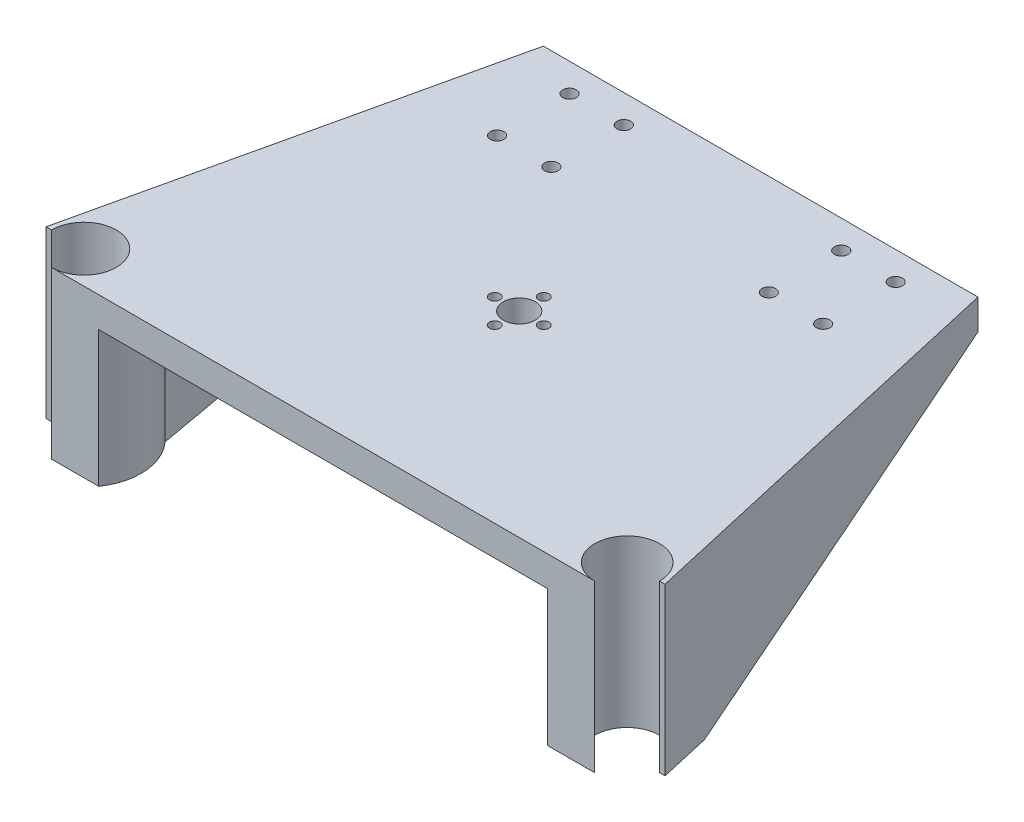
ISO-10303-21;
HEADER;
FILE_DESCRIPTION(('STEP AP214'),'2;1');
FILE_NAME('part.step','',(''),(''),'','','');
FILE_SCHEMA(('AUTOMOTIVE_DESIGN { 1 0 10303 214 1 1 1 1 }'));
ENDSEC;
DATA;
#1=APPLICATION_CONTEXT('core data for automotive mechanical design processes');
#2=APPLICATION_PROTOCOL_DEFINITION('international standard','automotive_design',2000,#1);
#3=PRODUCT_CONTEXT('',#1,'mechanical');
#4=PRODUCT('Part','Part','',(#3));
#5=PRODUCT_RELATED_PRODUCT_CATEGORY('part','',(#4));
#6=PRODUCT_DEFINITION_FORMATION('','',#4);
#7=PRODUCT_DEFINITION_CONTEXT('part definition',#1,'design');
#8=PRODUCT_DEFINITION('design','',#6,#7);
#9=PRODUCT_DEFINITION_SHAPE('','',#8);
#10=(LENGTH_UNIT() NAMED_UNIT(*) SI_UNIT(.MILLI.,.METRE.));
#11=(NAMED_UNIT(*) PLANE_ANGLE_UNIT() SI_UNIT($,.RADIAN.));
#12=(NAMED_UNIT(*) SI_UNIT($,.STERADIAN.) SOLID_ANGLE_UNIT());
#13=UNCERTAINTY_MEASURE_WITH_UNIT(LENGTH_MEASURE(1.E-05),#10,'distance_accuracy_value','');
#14=(GEOMETRIC_REPRESENTATION_CONTEXT(3) GLOBAL_UNCERTAINTY_ASSIGNED_CONTEXT((#13)) GLOBAL_UNIT_ASSIGNED_CONTEXT((#10,
#11,#12)) REPRESENTATION_CONTEXT('',''));
#15=CARTESIAN_POINT('',(0.,0.,0.));
#16=DIRECTION('',(0.,0.,1.));
#17=DIRECTION('',(1.,0.,0.));
#18=AXIS2_PLACEMENT_3D('',#15,#16,#17);
#19=CARTESIAN_POINT('',(0.,0.,0.));
#20=DIRECTION('',(0.,-1.,0.));
#21=DIRECTION('',(0.,0.,-1.));
#22=AXIS2_PLACEMENT_3D('',#19,#20,#21);
#23=PLANE('',#22);
#24=DIRECTION('',(0.128374864234024,0.,0.991725715222155));
#25=VECTOR('',#24,1.);
#26=CARTESIAN_POINT('',(165.,0.,-145.));
#27=LINE('',#26,#25);
#28=CARTESIAN_POINT('',(165.343404580368,0.,-142.347119663118));
#29=VERTEX_POINT('',#28);
#30=CARTESIAN_POINT('',(180.751158622614,0.,-23.3186323600494));
#31=VERTEX_POINT('',#30);
#32=EDGE_CURVE('E54',#29,#31,#27,.T.);
#33=ORIENTED_EDGE('',*,*,#32,.T.);
#34=CARTESIAN_POINT('',(195.,0.,-10.75));
#35=DIRECTION('',(0.,-1.,0.));
#36=DIRECTION('',(0.,0.,1.));
#37=AXIS2_PLACEMENT_3D('',#34,#35,#36);
#38=CIRCLE('',#37,19.);
#39=CARTESIAN_POINT('',(179.333554966107,0.,0.));
#40=VERTEX_POINT('',#39);
#41=EDGE_CURVE('E141',#40,#31,#38,.T.);
#42=ORIENTED_EDGE('',*,*,#41,.F.);
#43=DIRECTION('',(1.,0.,0.));
#44=VECTOR('',#43,1.);
#45=CARTESIAN_POINT('',(0.,0.,0.));
#46=LINE('',#45,#44);
#47=CARTESIAN_POINT('',(30.6664450338933,0.,0.));
#48=VERTEX_POINT('',#47);
#49=EDGE_CURVE('E311',#48,#40,#46,.T.);
#50=ORIENTED_EDGE('',*,*,#49,.F.);
#51=CARTESIAN_POINT('',(15.,0.,-10.75));
#52=DIRECTION('',(0.,-1.,0.));
#53=DIRECTION('',(0.,0.,1.));
#54=AXIS2_PLACEMENT_3D('',#51,#52,#53);
#55=CIRCLE('',#54,19.);
#56=CARTESIAN_POINT('',(29.2488413773864,0.,-23.3186323600494));
#57=VERTEX_POINT('',#56);
#58=EDGE_CURVE('E175',#57,#48,#55,.T.);
#59=ORIENTED_EDGE('',*,*,#58,.F.);
#60=DIRECTION('',(-0.128374864234025,0.,0.991725715222162));
#61=VECTOR('',#60,1.);
#62=CARTESIAN_POINT('',(25.7980604033702,0.,3.33945409597649));
#63=LINE('',#62,#61);
#64=CARTESIAN_POINT('',(44.6565954196317,0.,-142.347119663118));
#65=VERTEX_POINT('',#64);
#66=EDGE_CURVE('E172',#65,#57,#63,.T.);
#67=ORIENTED_EDGE('',*,*,#66,.F.);
#68=DIRECTION('',(0.975066755517526,0.,0.221911744359161));
#69=VECTOR('',#68,1.);
#70=CARTESIAN_POINT('',(33.,0.,-145.));
#71=LINE('',#70,#69);
#72=CARTESIAN_POINT('',(33.,0.,-145.));
#73=VERTEX_POINT('',#72);
#74=EDGE_CURVE('E158',#73,#65,#71,.T.);
#75=ORIENTED_EDGE('',*,*,#74,.F.);
#76=DIRECTION('',(-1.,0.,0.));
#77=VECTOR('',#76,1.);
#78=CARTESIAN_POINT('',(33.,0.,-145.));
#79=LINE('',#78,#77);
#80=CARTESIAN_POINT('',(177.,0.,-145.));
#81=VERTEX_POINT('',#80);
#82=EDGE_CURVE('E318',#81,#73,#79,.T.);
#83=ORIENTED_EDGE('',*,*,#82,.F.);
#84=DIRECTION('',(0.975066755517526,0.,-0.221911744359161));
#85=VECTOR('',#84,1.);
#86=CARTESIAN_POINT('',(165.064744053541,0.,-142.283700370806));
#87=LINE('',#86,#85);
#88=EDGE_CURVE('E49',#29,#81,#87,.T.);
#89=ORIENTED_EDGE('',*,*,#88,.F.);
#90=EDGE_LOOP('',(#33,#42,#50,#59,#67,#75,#83,#89));
#91=FACE_BOUND('',#90,.T.);
#92=CARTESIAN_POINT('',(105.,0.,-73.125));
#93=DIRECTION('',(0.,-1.,0.));
#94=DIRECTION('',(0.,0.,-1.));
#95=AXIS2_PLACEMENT_3D('',#92,#93,#94);
#96=CIRCLE('',#95,1.75);
#97=CARTESIAN_POINT('',(105.,0.,-74.875));
#98=VERTEX_POINT('',#97);
#99=EDGE_CURVE('E224',#98,#98,#96,.T.);
#100=ORIENTED_EDGE('',*,*,#99,.F.);
#101=EDGE_LOOP('',(#100));
#102=FACE_BOUND('',#101,.T.);
#103=CARTESIAN_POINT('',(113.125,0.,-65.0000000000001));
#104=DIRECTION('',(0.,-1.,0.));
#105=DIRECTION('',(0.,0.,-1.));
#106=AXIS2_PLACEMENT_3D('',#103,#104,#105);
#107=CIRCLE('',#106,1.74999999999998);
#108=CARTESIAN_POINT('',(113.125,0.,-66.75));
#109=VERTEX_POINT('',#108);
#110=EDGE_CURVE('E219',#109,#109,#107,.T.);
#111=ORIENTED_EDGE('',*,*,#110,.F.);
#112=EDGE_LOOP('',(#111));
#113=FACE_BOUND('',#112,.T.);
#114=CARTESIAN_POINT('',(96.875,0.,-65.));
#115=DIRECTION('',(0.,-1.,0.));
#116=DIRECTION('',(0.,0.,-1.));
#117=AXIS2_PLACEMENT_3D('',#114,#115,#116);
#118=CIRCLE('',#117,1.74999999999999);
#119=CARTESIAN_POINT('',(96.875,0.,-66.75));
#120=VERTEX_POINT('',#119);
#121=EDGE_CURVE('E212',#120,#120,#118,.T.);
#122=ORIENTED_EDGE('',*,*,#121,.F.);
#123=EDGE_LOOP('',(#122));
#124=FACE_BOUND('',#123,.T.);
#125=CARTESIAN_POINT('',(105.,0.,-56.875));
#126=DIRECTION('',(0.,-1.,0.));
#127=DIRECTION('',(0.,0.,-1.));
#128=AXIS2_PLACEMENT_3D('',#125,#126,#127);
#129=CIRCLE('',#128,1.75);
#130=CARTESIAN_POINT('',(105.,0.,-58.625));
#131=VERTEX_POINT('',#130);
#132=EDGE_CURVE('E211',#131,#131,#129,.T.);
#133=ORIENTED_EDGE('',*,*,#132,.F.);
#134=EDGE_LOOP('',(#133));
#135=FACE_BOUND('',#134,.T.);
#136=CARTESIAN_POINT('',(105.,0.,-65.));
#137=DIRECTION('',(0.,-1.,0.));
#138=DIRECTION('',(0.,0.,-1.));
#139=AXIS2_PLACEMENT_3D('',#136,#137,#138);
#140=CIRCLE('',#139,5.3);
#141=CARTESIAN_POINT('',(105.,0.,-70.3));
#142=VERTEX_POINT('',#141);
#143=EDGE_CURVE('E231',#142,#142,#140,.T.);
#144=ORIENTED_EDGE('',*,*,#143,.F.);
#145=EDGE_LOOP('',(#144));
#146=FACE_BOUND('',#145,.T.);
#147=CARTESIAN_POINT('',(50.9750000000004,0.,-111.675000000001));
#148=DIRECTION('',(0.,-1.,0.));
#149=DIRECTION('',(0.,0.,1.));
#150=AXIS2_PLACEMENT_3D('',#147,#148,#149);
#151=CIRCLE('',#150,2.25000000000001);
#152=CARTESIAN_POINT('',(50.9750000000004,0.,-109.425000000001));
#153=VERTEX_POINT('',#152);
#154=EDGE_CURVE('E269',#153,#153,#151,.T.);
#155=ORIENTED_EDGE('',*,*,#154,.F.);
#156=EDGE_LOOP('',(#155));
#157=FACE_BOUND('',#156,.T.);
#158=CARTESIAN_POINT('',(141.025,0.,-111.675000000001));
#159=DIRECTION('',(0.,-1.,0.));
#160=DIRECTION('',(0.,0.,-1.));
#161=AXIS2_PLACEMENT_3D('',#158,#159,#160);
#162=CIRCLE('',#161,2.25000000000001);
#163=CARTESIAN_POINT('',(141.025,0.,-113.925000000001));
#164=VERTEX_POINT('',#163);
#165=EDGE_CURVE('E288',#164,#164,#162,.T.);
#166=ORIENTED_EDGE('',*,*,#165,.F.);
#167=EDGE_LOOP('',(#166));
#168=FACE_BOUND('',#167,.T.);
#169=CARTESIAN_POINT('',(159.025,0.,-111.675000000001));
#170=DIRECTION('',(0.,-1.,0.));
#171=DIRECTION('',(0.,0.,-1.));
#172=AXIS2_PLACEMENT_3D('',#169,#170,#171);
#173=CIRCLE('',#172,2.25000000000001);
#174=CARTESIAN_POINT('',(159.025,0.,-113.925000000001));
#175=VERTEX_POINT('',#174);
#176=EDGE_CURVE('E287',#175,#175,#173,.T.);
#177=ORIENTED_EDGE('',*,*,#176,.F.);
#178=EDGE_LOOP('',(#177));
#179=FACE_BOUND('',#178,.T.);
#180=CARTESIAN_POINT('',(141.025,0.,-135.675000000001));
#181=DIRECTION('',(0.,-1.,0.));
#182=DIRECTION('',(0.,0.,-1.));
#183=AXIS2_PLACEMENT_3D('',#180,#181,#182);
#184=CIRCLE('',#183,2.25000000000001);
#185=CARTESIAN_POINT('',(141.025,0.,-137.925000000001));
#186=VERTEX_POINT('',#185);
#187=EDGE_CURVE('E300',#186,#186,#184,.T.);
#188=ORIENTED_EDGE('',*,*,#187,.F.);
#189=EDGE_LOOP('',(#188));
#190=FACE_BOUND('',#189,.T.);
#191=CARTESIAN_POINT('',(50.9750000000004,0.,-135.675000000001));
#192=DIRECTION('',(0.,-1.,0.));
#193=DIRECTION('',(0.,0.,1.));
#194=AXIS2_PLACEMENT_3D('',#191,#192,#193);
#195=CIRCLE('',#194,2.25000000000001);
#196=CARTESIAN_POINT('',(50.9750000000004,0.,-133.425000000001));
#197=VERTEX_POINT('',#196);
#198=EDGE_CURVE('E270',#197,#197,#195,.T.);
#199=ORIENTED_EDGE('',*,*,#198,.F.);
#200=EDGE_LOOP('',(#199));
#201=FACE_BOUND('',#200,.T.);
#202=CARTESIAN_POINT('',(68.9750000000004,0.,-135.675000000001));
#203=DIRECTION('',(0.,-1.,0.));
#204=DIRECTION('',(0.,0.,1.));
#205=AXIS2_PLACEMENT_3D('',#202,#203,#204);
#206=CIRCLE('',#205,2.25000000000001);
#207=CARTESIAN_POINT('',(68.9750000000004,0.,-133.425000000001));
#208=VERTEX_POINT('',#207);
#209=EDGE_CURVE('E276',#208,#208,#206,.T.);
#210=ORIENTED_EDGE('',*,*,#209,.F.);
#211=EDGE_LOOP('',(#210));
#212=FACE_BOUND('',#211,.T.);
#213=CARTESIAN_POINT('',(68.9750000000004,0.,-111.675000000001));
#214=DIRECTION('',(0.,-1.,0.));
#215=DIRECTION('',(0.,0.,1.));
#216=AXIS2_PLACEMENT_3D('',#213,#214,#215);
#217=CIRCLE('',#216,2.25000000000001);
#218=CARTESIAN_POINT('',(68.9750000000004,0.,-109.425000000001));
#219=VERTEX_POINT('',#218);
#220=EDGE_CURVE('E251',#219,#219,#217,.T.);
#221=ORIENTED_EDGE('',*,*,#220,.F.);
#222=EDGE_LOOP('',(#221));
#223=FACE_BOUND('',#222,.T.);
#224=CARTESIAN_POINT('',(159.025,0.,-135.675000000001));
#225=DIRECTION('',(0.,-1.,0.));
#226=DIRECTION('',(0.,0.,-1.));
#227=AXIS2_PLACEMENT_3D('',#224,#225,#226);
#228=CIRCLE('',#227,2.25000000000001);
#229=CARTESIAN_POINT('',(159.025,0.,-137.925000000001));
#230=VERTEX_POINT('',#229);
#231=EDGE_CURVE('E299',#230,#230,#228,.T.);
#232=ORIENTED_EDGE('',*,*,#231,.F.);
#233=EDGE_LOOP('',(#232));
#234=FACE_BOUND('',#233,.T.);
#235=ADVANCED_FACE('F34',(#91,#102,#113,#124,#135,#146,#157,#168,#179,#190,#201,#212,#223,#234),
#23,.T.);
#236=CARTESIAN_POINT('',(0.,10.,0.));
#237=DIRECTION('',(0.,0.,-1.));
#238=DIRECTION('',(-1.,0.,0.));
#239=AXIS2_PLACEMENT_3D('',#236,#237,#238);
#240=PLANE('',#239);
#241=DIRECTION('',(0.,1.,0.));
#242=VECTOR('',#241,1.);
#243=CARTESIAN_POINT('',(15.,0.,0.));
#244=LINE('',#243,#242);
#245=CARTESIAN_POINT('',(15.,-45.,0.));
#246=VERTEX_POINT('',#245);
#247=CARTESIAN_POINT('',(15.,10.,0.));
#248=VERTEX_POINT('',#247);
#249=EDGE_CURVE('E245',#246,#248,#244,.T.);
#250=ORIENTED_EDGE('',*,*,#249,.F.);
#251=DIRECTION('',(-1.,0.,0.));
#252=VECTOR('',#251,1.);
#253=CARTESIAN_POINT('',(30.6664450338933,-45.,0.));
#254=LINE('',#253,#252);
#255=CARTESIAN_POINT('',(30.6664450338933,-45.,0.));
#256=VERTEX_POINT('',#255);
#257=EDGE_CURVE('E179',#256,#246,#254,.T.);
#258=ORIENTED_EDGE('',*,*,#257,.F.);
#259=DIRECTION('',(0.,1.,0.));
#260=VECTOR('',#259,1.);
#261=CARTESIAN_POINT('',(30.6664450338933,-45.,0.));
#262=LINE('',#261,#260);
#263=EDGE_CURVE('E190',#256,#48,#262,.T.);
#264=ORIENTED_EDGE('',*,*,#263,.T.);
#265=ORIENTED_EDGE('',*,*,#49,.T.);
#266=DIRECTION('',(0.,1.,0.));
#267=VECTOR('',#266,1.);
#268=CARTESIAN_POINT('',(179.333554966107,-45.,0.));
#269=LINE('',#268,#267);
#270=CARTESIAN_POINT('',(179.333554966107,-45.,0.));
#271=VERTEX_POINT('',#270);
#272=EDGE_CURVE('E208',#271,#40,#269,.T.);
#273=ORIENTED_EDGE('',*,*,#272,.F.);
#274=DIRECTION('',(-1.,0.,0.));
#275=VECTOR('',#274,1.);
#276=CARTESIAN_POINT('',(195.,-45.,0.));
#277=LINE('',#276,#275);
#278=CARTESIAN_POINT('',(195.,-45.,0.));
#279=VERTEX_POINT('',#278);
#280=EDGE_CURVE('E206',#279,#271,#277,.T.);
#281=ORIENTED_EDGE('',*,*,#280,.F.);
#282=DIRECTION('',(0.,1.,0.));
#283=VECTOR('',#282,1.);
#284=CARTESIAN_POINT('',(195.,0.,0.));
#285=LINE('',#284,#283);
#286=CARTESIAN_POINT('',(195.,10.,0.));
#287=VERTEX_POINT('',#286);
#288=EDGE_CURVE('E248',#279,#287,#285,.T.);
#289=ORIENTED_EDGE('',*,*,#288,.T.);
#290=DIRECTION('',(1.,0.,0.));
#291=VECTOR('',#290,1.);
#292=CARTESIAN_POINT('',(0.,10.,0.));
#293=LINE('',#292,#291);
#294=EDGE_CURVE('E317',#248,#287,#293,.T.);
#295=ORIENTED_EDGE('',*,*,#294,.F.);
#296=EDGE_LOOP('',(#250,#258,#264,#265,#273,#281,#289,#295));
#297=FACE_BOUND('',#296,.T.);
#298=ADVANCED_FACE('F349',(#297),#240,.F.);
#299=CARTESIAN_POINT('',(0.,10.,0.));
#300=DIRECTION('',(0.975066755517526,0.,0.221911744359161));
#301=DIRECTION('',(0.221911744359161,0.,-0.975066755517526));
#302=AXIS2_PLACEMENT_3D('',#299,#300,#301);
#303=PLANE('',#302);
#304=DIRECTION('',(0.,-1.,0.));
#305=VECTOR('',#304,1.);
#306=CARTESIAN_POINT('',(33.,10.,-145.));
#307=LINE('',#306,#305);
#308=CARTESIAN_POINT('',(33.,10.,-145.));
#309=VERTEX_POINT('',#308);
#310=EDGE_CURVE('E42',#309,#73,#307,.T.);
#311=ORIENTED_EDGE('',*,*,#310,.T.);
#312=DIRECTION('',(0.20786013069928,0.350188442483803,-0.913324816708955));
#313=VECTOR('',#312,1.);
#314=CARTESIAN_POINT('',(-7.22074976255128,-67.7611510562157,31.7275368354526));
#315=LINE('',#314,#313);
#316=CARTESIAN_POINT('',(6.28950717184159,-45.,-27.6357133308191));
#317=VERTEX_POINT('',#316);
#318=EDGE_CURVE('E159',#317,#73,#315,.T.);
#319=ORIENTED_EDGE('',*,*,#318,.F.);
#320=DIRECTION('',(0.221911744359161,0.,-0.975066755517526));
#321=VECTOR('',#320,1.);
#322=CARTESIAN_POINT('',(2.44655172413793,-45.,-10.75));
#323=LINE('',#322,#321);
#324=CARTESIAN_POINT('',(2.44655172413793,-45.,-10.75));
#325=VERTEX_POINT('',#324);
#326=EDGE_CURVE('E188',#325,#317,#323,.T.);
#327=ORIENTED_EDGE('',*,*,#326,.F.);
#328=DIRECTION('',(0.,1.,0.));
#329=VECTOR('',#328,1.);
#330=CARTESIAN_POINT('',(2.44655172413793,0.,-10.75));
#331=LINE('',#330,#329);
#332=CARTESIAN_POINT('',(2.44655172413793,10.,-10.75));
#333=VERTEX_POINT('',#332);
#334=EDGE_CURVE('E262',#325,#333,#331,.T.);
#335=ORIENTED_EDGE('',*,*,#334,.T.);
#336=DIRECTION('',(-0.221911744359161,0.,0.975066755517526));
#337=VECTOR('',#336,1.);
#338=CARTESIAN_POINT('',(0.,10.,0.));
#339=LINE('',#338,#337);
#340=EDGE_CURVE('E314',#309,#333,#339,.T.);
#341=ORIENTED_EDGE('',*,*,#340,.F.);
#342=EDGE_LOOP('',(#311,#319,#327,#335,#341));
#343=FACE_BOUND('',#342,.T.);
#344=ADVANCED_FACE('F36',(#343),#303,.F.);
#345=CARTESIAN_POINT('',(177.,10.,-145.));
#346=DIRECTION('',(-0.975066755517526,0.,0.221911744359161));
#347=DIRECTION('',(0.221911744359161,0.,0.975066755517526));
#348=AXIS2_PLACEMENT_3D('',#345,#346,#347);
#349=PLANE('',#348);
#350=DIRECTION('',(0.207860130699279,-0.350188442483803,0.913324816708955));
#351=VECTOR('',#350,1.);
#352=CARTESIAN_POINT('',(211.702537089852,-58.4644461294648,7.48084478874186));
#353=LINE('',#352,#351);
#354=CARTESIAN_POINT('',(203.710492828158,-45.,-27.6357133308191));
#355=VERTEX_POINT('',#354);
#356=EDGE_CURVE('E150',#81,#355,#353,.T.);
#357=ORIENTED_EDGE('',*,*,#356,.F.);
#358=DIRECTION('',(0.,-1.,0.));
#359=VECTOR('',#358,1.);
#360=CARTESIAN_POINT('',(177.,10.,-145.));
#361=LINE('',#360,#359);
#362=CARTESIAN_POINT('',(177.,10.,-145.));
#363=VERTEX_POINT('',#362);
#364=EDGE_CURVE('E11',#363,#81,#361,.T.);
#365=ORIENTED_EDGE('',*,*,#364,.F.);
#366=DIRECTION('',(-0.221911744359161,0.,-0.975066755517526));
#367=VECTOR('',#366,1.);
#368=CARTESIAN_POINT('',(177.,10.,-145.));
#369=LINE('',#368,#367);
#370=CARTESIAN_POINT('',(207.553448275862,10.,-10.75));
#371=VERTEX_POINT('',#370);
#372=EDGE_CURVE('E321',#371,#363,#369,.T.);
#373=ORIENTED_EDGE('',*,*,#372,.F.);
#374=DIRECTION('',(0.,1.,0.));
#375=VECTOR('',#374,1.);
#376=CARTESIAN_POINT('',(207.553448275862,0.,-10.75));
#377=LINE('',#376,#375);
#378=CARTESIAN_POINT('',(207.553448275862,-45.,-10.75));
#379=VERTEX_POINT('',#378);
#380=EDGE_CURVE('E252',#379,#371,#377,.T.);
#381=ORIENTED_EDGE('',*,*,#380,.F.);
#382=DIRECTION('',(0.221911744359161,0.,0.975066755517526));
#383=VECTOR('',#382,1.);
#384=CARTESIAN_POINT('',(203.710492828158,-45.,-27.6357133308191));
#385=LINE('',#384,#383);
#386=EDGE_CURVE('E197',#355,#379,#385,.T.);
#387=ORIENTED_EDGE('',*,*,#386,.F.);
#388=EDGE_LOOP('',(#357,#365,#373,#381,#387));
#389=FACE_BOUND('',#388,.T.);
#390=ADVANCED_FACE('F366',(#389),#349,.F.);
#391=CARTESIAN_POINT('',(33.,10.,-145.));
#392=DIRECTION('',(0.,0.,1.));
#393=DIRECTION('',(1.,0.,0.));
#394=AXIS2_PLACEMENT_3D('',#391,#392,#393);
#395=PLANE('',#394);
#396=ORIENTED_EDGE('',*,*,#82,.T.);
#397=ORIENTED_EDGE('',*,*,#310,.F.);
#398=DIRECTION('',(-1.,0.,0.));
#399=VECTOR('',#398,1.);
#400=CARTESIAN_POINT('',(33.,10.,-145.));
#401=LINE('',#400,#399);
#402=EDGE_CURVE('E323',#363,#309,#401,.T.);
#403=ORIENTED_EDGE('',*,*,#402,.F.);
#404=ORIENTED_EDGE('',*,*,#364,.T.);
#405=EDGE_LOOP('',(#396,#397,#403,#404));
#406=FACE_BOUND('',#405,.T.);
#407=ADVANCED_FACE('F364',(#406),#395,.F.);
#408=CARTESIAN_POINT('',(0.,10.,0.));
#409=DIRECTION('',(0.,-1.,0.));
#410=DIRECTION('',(0.,0.,-1.));
#411=AXIS2_PLACEMENT_3D('',#408,#409,#410);
#412=PLANE('',#411);
#413=CARTESIAN_POINT('',(105.,10.,-73.125));
#414=DIRECTION('',(0.,-1.,0.));
#415=DIRECTION('',(0.,0.,-1.));
#416=AXIS2_PLACEMENT_3D('',#413,#414,#415);
#417=CIRCLE('',#416,1.75);
#418=CARTESIAN_POINT('',(105.,10.,-74.875));
#419=VERTEX_POINT('',#418);
#420=EDGE_CURVE('E227',#419,#419,#417,.F.);
#421=ORIENTED_EDGE('',*,*,#420,.F.);
#422=EDGE_LOOP('',(#421));
#423=FACE_BOUND('',#422,.T.);
#424=CARTESIAN_POINT('',(113.125,10.,-65.0000000000001));
#425=DIRECTION('',(0.,-1.,0.));
#426=DIRECTION('',(0.,0.,-1.));
#427=AXIS2_PLACEMENT_3D('',#424,#425,#426);
#428=CIRCLE('',#427,1.74999999999998);
#429=CARTESIAN_POINT('',(113.125,10.,-66.75));
#430=VERTEX_POINT('',#429);
#431=EDGE_CURVE('E228',#430,#430,#428,.F.);
#432=ORIENTED_EDGE('',*,*,#431,.F.);
#433=EDGE_LOOP('',(#432));
#434=FACE_BOUND('',#433,.T.);
#435=CARTESIAN_POINT('',(96.875,10.,-65.));
#436=DIRECTION('',(0.,-1.,0.));
#437=DIRECTION('',(0.,0.,-1.));
#438=AXIS2_PLACEMENT_3D('',#435,#436,#437);
#439=CIRCLE('',#438,1.74999999999999);
#440=CARTESIAN_POINT('',(96.875,10.,-66.75));
#441=VERTEX_POINT('',#440);
#442=EDGE_CURVE('E215',#441,#441,#439,.F.);
#443=ORIENTED_EDGE('',*,*,#442,.F.);
#444=EDGE_LOOP('',(#443));
#445=FACE_BOUND('',#444,.T.);
#446=CARTESIAN_POINT('',(105.,10.,-56.875));
#447=DIRECTION('',(0.,-1.,0.));
#448=DIRECTION('',(0.,0.,-1.));
#449=AXIS2_PLACEMENT_3D('',#446,#447,#448);
#450=CIRCLE('',#449,1.75);
#451=CARTESIAN_POINT('',(105.,10.,-58.625));
#452=VERTEX_POINT('',#451);
#453=EDGE_CURVE('E216',#452,#452,#450,.F.);
#454=ORIENTED_EDGE('',*,*,#453,.F.);
#455=EDGE_LOOP('',(#454));
#456=FACE_BOUND('',#455,.T.);
#457=CARTESIAN_POINT('',(105.,10.,-65.));
#458=DIRECTION('',(0.,-1.,0.));
#459=DIRECTION('',(0.,0.,-1.));
#460=AXIS2_PLACEMENT_3D('',#457,#458,#459);
#461=CIRCLE('',#460,5.3);
#462=CARTESIAN_POINT('',(105.,10.,-70.3));
#463=VERTEX_POINT('',#462);
#464=EDGE_CURVE('E238',#463,#463,#461,.F.);
#465=ORIENTED_EDGE('',*,*,#464,.F.);
#466=EDGE_LOOP('',(#465));
#467=FACE_BOUND('',#466,.T.);
#468=CARTESIAN_POINT('',(50.9750000000004,10.,-111.675000000001));
#469=DIRECTION('',(0.,-1.,0.));
#470=DIRECTION('',(0.,0.,1.));
#471=AXIS2_PLACEMENT_3D('',#468,#469,#470);
#472=CIRCLE('',#471,2.25000000000001);
#473=CARTESIAN_POINT('',(50.9750000000004,10.,-109.425000000001));
#474=VERTEX_POINT('',#473);
#475=EDGE_CURVE('E291',#474,#474,#472,.T.);
#476=ORIENTED_EDGE('',*,*,#475,.T.);
#477=EDGE_LOOP('',(#476));
#478=FACE_BOUND('',#477,.T.);
#479=CARTESIAN_POINT('',(141.025,10.,-111.675000000001));
#480=DIRECTION('',(0.,-1.,0.));
#481=DIRECTION('',(0.,0.,-1.));
#482=AXIS2_PLACEMENT_3D('',#479,#480,#481);
#483=CIRCLE('',#482,2.25000000000001);
#484=CARTESIAN_POINT('',(141.025,10.,-113.925000000001));
#485=VERTEX_POINT('',#484);
#486=EDGE_CURVE('E284',#485,#485,#483,.T.);
#487=ORIENTED_EDGE('',*,*,#486,.T.);
#488=EDGE_LOOP('',(#487));
#489=FACE_BOUND('',#488,.T.);
#490=CARTESIAN_POINT('',(159.025,10.,-111.675000000001));
#491=DIRECTION('',(0.,-1.,0.));
#492=DIRECTION('',(0.,0.,-1.));
#493=AXIS2_PLACEMENT_3D('',#490,#491,#492);
#494=CIRCLE('',#493,2.25000000000001);
#495=CARTESIAN_POINT('',(159.025,10.,-113.925000000001));
#496=VERTEX_POINT('',#495);
#497=EDGE_CURVE('E303',#496,#496,#494,.T.);
#498=ORIENTED_EDGE('',*,*,#497,.T.);
#499=EDGE_LOOP('',(#498));
#500=FACE_BOUND('',#499,.T.);
#501=CARTESIAN_POINT('',(141.025,10.,-135.675000000001));
#502=DIRECTION('',(0.,-1.,0.));
#503=DIRECTION('',(0.,0.,-1.));
#504=AXIS2_PLACEMENT_3D('',#501,#502,#503);
#505=CIRCLE('',#504,2.25000000000001);
#506=CARTESIAN_POINT('',(141.025,10.,-137.925000000001));
#507=VERTEX_POINT('',#506);
#508=EDGE_CURVE('E296',#507,#507,#505,.T.);
#509=ORIENTED_EDGE('',*,*,#508,.T.);
#510=EDGE_LOOP('',(#509));
#511=FACE_BOUND('',#510,.T.);
#512=CARTESIAN_POINT('',(50.9750000000004,10.,-135.675000000001));
#513=DIRECTION('',(0.,-1.,0.));
#514=DIRECTION('',(0.,0.,1.));
#515=AXIS2_PLACEMENT_3D('',#512,#513,#514);
#516=CIRCLE('',#515,2.25000000000001);
#517=CARTESIAN_POINT('',(50.9750000000004,10.,-133.425000000001));
#518=VERTEX_POINT('',#517);
#519=EDGE_CURVE('E266',#518,#518,#516,.T.);
#520=ORIENTED_EDGE('',*,*,#519,.T.);
#521=EDGE_LOOP('',(#520));
#522=FACE_BOUND('',#521,.T.);
#523=CARTESIAN_POINT('',(68.9750000000004,10.,-135.675000000001));
#524=DIRECTION('',(0.,-1.,0.));
#525=DIRECTION('',(0.,0.,1.));
#526=AXIS2_PLACEMENT_3D('',#523,#524,#525);
#527=CIRCLE('',#526,2.25000000000001);
#528=CARTESIAN_POINT('',(68.9750000000004,10.,-133.425000000001));
#529=VERTEX_POINT('',#528);
#530=EDGE_CURVE('E273',#529,#529,#527,.T.);
#531=ORIENTED_EDGE('',*,*,#530,.T.);
#532=EDGE_LOOP('',(#531));
#533=FACE_BOUND('',#532,.T.);
#534=CARTESIAN_POINT('',(68.9750000000004,10.,-111.675000000001));
#535=DIRECTION('',(0.,-1.,0.));
#536=DIRECTION('',(0.,0.,1.));
#537=AXIS2_PLACEMENT_3D('',#534,#535,#536);
#538=CIRCLE('',#537,2.25000000000001);
#539=CARTESIAN_POINT('',(68.9750000000004,10.,-109.425000000001));
#540=VERTEX_POINT('',#539);
#541=EDGE_CURVE('E279',#540,#540,#538,.T.);
#542=ORIENTED_EDGE('',*,*,#541,.T.);
#543=EDGE_LOOP('',(#542));
#544=FACE_BOUND('',#543,.T.);
#545=CARTESIAN_POINT('',(159.025,10.,-135.675000000001));
#546=DIRECTION('',(0.,-1.,0.));
#547=DIRECTION('',(0.,0.,-1.));
#548=AXIS2_PLACEMENT_3D('',#545,#546,#547);
#549=CIRCLE('',#548,2.25000000000001);
#550=CARTESIAN_POINT('',(159.025,10.,-137.925000000001));
#551=VERTEX_POINT('',#550);
#552=EDGE_CURVE('E308',#551,#551,#549,.T.);
#553=ORIENTED_EDGE('',*,*,#552,.T.);
#554=EDGE_LOOP('',(#553));
#555=FACE_BOUND('',#554,.T.);
#556=ORIENTED_EDGE('',*,*,#294,.T.);
#557=CARTESIAN_POINT('',(195.,10.,-10.75));
#558=DIRECTION('',(0.,1.,0.));
#559=DIRECTION('',(0.,0.,1.));
#560=AXIS2_PLACEMENT_3D('',#557,#558,#559);
#561=CIRCLE('',#560,10.75);
#562=CARTESIAN_POINT('',(205.75,10.,-10.75));
#563=VERTEX_POINT('',#562);
#564=EDGE_CURVE('E242',#563,#287,#561,.T.);
#565=ORIENTED_EDGE('',*,*,#564,.F.);
#566=DIRECTION('',(-1.,0.,0.));
#567=VECTOR('',#566,1.);
#568=CARTESIAN_POINT('',(205.75,10.,-10.75));
#569=LINE('',#568,#567);
#570=EDGE_CURVE('E244',#371,#563,#569,.T.);
#571=ORIENTED_EDGE('',*,*,#570,.F.);
#572=ORIENTED_EDGE('',*,*,#372,.T.);
#573=ORIENTED_EDGE('',*,*,#402,.T.);
#574=ORIENTED_EDGE('',*,*,#340,.T.);
#575=DIRECTION('',(-1.,0.,0.));
#576=VECTOR('',#575,1.);
#577=CARTESIAN_POINT('',(4.25,10.,-10.75));
#578=LINE('',#577,#576);
#579=CARTESIAN_POINT('',(4.25,10.,-10.75));
#580=VERTEX_POINT('',#579);
#581=EDGE_CURVE('E258',#580,#333,#578,.T.);
#582=ORIENTED_EDGE('',*,*,#581,.F.);
#583=CARTESIAN_POINT('',(15.,10.,-10.75));
#584=DIRECTION('',(0.,1.,0.));
#585=DIRECTION('',(0.,0.,1.));
#586=AXIS2_PLACEMENT_3D('',#583,#584,#585);
#587=CIRCLE('',#586,10.75);
#588=EDGE_CURVE('E241',#248,#580,#587,.T.);
#589=ORIENTED_EDGE('',*,*,#588,.F.);
#590=EDGE_LOOP('',(#556,#565,#571,#572,#573,#574,#582,#589));
#591=FACE_BOUND('',#590,.T.);
#592=ADVANCED_FACE('F359',(#423,#434,#445,#456,#467,#478,#489,#500,#511,#522,#533,#544,#555,
#591),#412,.F.);
#593=CARTESIAN_POINT('',(159.025,10.,-135.675000000001));
#594=DIRECTION('',(0.,-1.,0.));
#595=DIRECTION('',(0.,0.,-1.));
#596=AXIS2_PLACEMENT_3D('',#593,#594,#595);
#597=CYLINDRICAL_SURFACE('',#596,2.25000000000001);
#598=ORIENTED_EDGE('',*,*,#552,.F.);
#599=EDGE_LOOP('',(#598));
#600=FACE_BOUND('',#599,.T.);
#601=ORIENTED_EDGE('',*,*,#231,.T.);
#602=EDGE_LOOP('',(#601));
#603=FACE_BOUND('',#602,.T.);
#604=ADVANCED_FACE('F579',(#600,#603),#597,.F.);
#605=CARTESIAN_POINT('',(68.9750000000004,10.,-111.675000000001));
#606=DIRECTION('',(0.,-1.,0.));
#607=DIRECTION('',(0.,0.,-1.));
#608=AXIS2_PLACEMENT_3D('',#605,#606,#607);
#609=CYLINDRICAL_SURFACE('',#608,2.25000000000001);
#610=ORIENTED_EDGE('',*,*,#541,.F.);
#611=EDGE_LOOP('',(#610));
#612=FACE_BOUND('',#611,.T.);
#613=ORIENTED_EDGE('',*,*,#220,.T.);
#614=EDGE_LOOP('',(#613));
#615=FACE_BOUND('',#614,.T.);
#616=ADVANCED_FACE('F588',(#612,#615),#609,.F.);
#617=CARTESIAN_POINT('',(68.9750000000004,10.,-135.675000000001));
#618=DIRECTION('',(0.,-1.,0.));
#619=DIRECTION('',(0.,0.,-1.));
#620=AXIS2_PLACEMENT_3D('',#617,#618,#619);
#621=CYLINDRICAL_SURFACE('',#620,2.25000000000001);
#622=ORIENTED_EDGE('',*,*,#530,.F.);
#623=EDGE_LOOP('',(#622));
#624=FACE_BOUND('',#623,.T.);
#625=ORIENTED_EDGE('',*,*,#209,.T.);
#626=EDGE_LOOP('',(#625));
#627=FACE_BOUND('',#626,.T.);
#628=ADVANCED_FACE('F596',(#624,#627),#621,.F.);
#629=CARTESIAN_POINT('',(50.9750000000004,10.,-135.675000000001));
#630=DIRECTION('',(0.,-1.,0.));
#631=DIRECTION('',(0.,0.,-1.));
#632=AXIS2_PLACEMENT_3D('',#629,#630,#631);
#633=CYLINDRICAL_SURFACE('',#632,2.25000000000001);
#634=ORIENTED_EDGE('',*,*,#519,.F.);
#635=EDGE_LOOP('',(#634));
#636=FACE_BOUND('',#635,.T.);
#637=ORIENTED_EDGE('',*,*,#198,.T.);
#638=EDGE_LOOP('',(#637));
#639=FACE_BOUND('',#638,.T.);
#640=ADVANCED_FACE('F605',(#636,#639),#633,.F.);
#641=CARTESIAN_POINT('',(141.025,10.,-135.675000000001));
#642=DIRECTION('',(0.,-1.,0.));
#643=DIRECTION('',(0.,0.,-1.));
#644=AXIS2_PLACEMENT_3D('',#641,#642,#643);
#645=CYLINDRICAL_SURFACE('',#644,2.25000000000001);
#646=ORIENTED_EDGE('',*,*,#508,.F.);
#647=EDGE_LOOP('',(#646));
#648=FACE_BOUND('',#647,.T.);
#649=ORIENTED_EDGE('',*,*,#187,.T.);
#650=EDGE_LOOP('',(#649));
#651=FACE_BOUND('',#650,.T.);
#652=ADVANCED_FACE('F614',(#648,#651),#645,.F.);
#653=CARTESIAN_POINT('',(159.025,10.,-111.675000000001));
#654=DIRECTION('',(0.,-1.,0.));
#655=DIRECTION('',(0.,0.,-1.));
#656=AXIS2_PLACEMENT_3D('',#653,#654,#655);
#657=CYLINDRICAL_SURFACE('',#656,2.25000000000001);
#658=ORIENTED_EDGE('',*,*,#497,.F.);
#659=EDGE_LOOP('',(#658));
#660=FACE_BOUND('',#659,.T.);
#661=ORIENTED_EDGE('',*,*,#176,.T.);
#662=EDGE_LOOP('',(#661));
#663=FACE_BOUND('',#662,.T.);
#664=ADVANCED_FACE('F623',(#660,#663),#657,.F.);
#665=CARTESIAN_POINT('',(141.025,10.,-111.675000000001));
#666=DIRECTION('',(0.,-1.,0.));
#667=DIRECTION('',(0.,0.,-1.));
#668=AXIS2_PLACEMENT_3D('',#665,#666,#667);
#669=CYLINDRICAL_SURFACE('',#668,2.25000000000001);
#670=ORIENTED_EDGE('',*,*,#486,.F.);
#671=EDGE_LOOP('',(#670));
#672=FACE_BOUND('',#671,.T.);
#673=ORIENTED_EDGE('',*,*,#165,.T.);
#674=EDGE_LOOP('',(#673));
#675=FACE_BOUND('',#674,.T.);
#676=ADVANCED_FACE('F632',(#672,#675),#669,.F.);
#677=CARTESIAN_POINT('',(50.9750000000004,10.,-111.675000000001));
#678=DIRECTION('',(0.,-1.,0.));
#679=DIRECTION('',(0.,0.,-1.));
#680=AXIS2_PLACEMENT_3D('',#677,#678,#679);
#681=CYLINDRICAL_SURFACE('',#680,2.25000000000001);
#682=ORIENTED_EDGE('',*,*,#475,.F.);
#683=EDGE_LOOP('',(#682));
#684=FACE_BOUND('',#683,.T.);
#685=ORIENTED_EDGE('',*,*,#154,.T.);
#686=EDGE_LOOP('',(#685));
#687=FACE_BOUND('',#686,.T.);
#688=ADVANCED_FACE('F386',(#684,#687),#681,.F.);
#689=CARTESIAN_POINT('',(15.,0.,-10.75));
#690=DIRECTION('',(0.,1.,0.));
#691=DIRECTION('',(0.,0.,1.));
#692=AXIS2_PLACEMENT_3D('',#689,#690,#691);
#693=CYLINDRICAL_SURFACE('',#692,10.75);
#694=ORIENTED_EDGE('',*,*,#588,.T.);
#695=DIRECTION('',(0.,1.,0.));
#696=VECTOR('',#695,1.);
#697=CARTESIAN_POINT('',(4.25,0.,-10.75));
#698=LINE('',#697,#696);
#699=CARTESIAN_POINT('',(4.25,-45.,-10.75));
#700=VERTEX_POINT('',#699);
#701=EDGE_CURVE('E260',#700,#580,#698,.T.);
#702=ORIENTED_EDGE('',*,*,#701,.F.);
#703=CARTESIAN_POINT('',(15.,-45.,-10.75));
#704=DIRECTION('',(0.,1.,0.));
#705=DIRECTION('',(0.,0.,-1.));
#706=AXIS2_PLACEMENT_3D('',#703,#704,#705);
#707=CIRCLE('',#706,10.75);
#708=EDGE_CURVE('E182',#246,#700,#707,.T.);
#709=ORIENTED_EDGE('',*,*,#708,.F.);
#710=ORIENTED_EDGE('',*,*,#249,.T.);
#711=EDGE_LOOP('',(#694,#702,#709,#710));
#712=FACE_BOUND('',#711,.T.);
#713=ADVANCED_FACE('F375',(#712),#693,.F.);
#714=CARTESIAN_POINT('',(4.25,0.,-10.75));
#715=DIRECTION('',(0.,0.,-1.));
#716=DIRECTION('',(-1.,0.,0.));
#717=AXIS2_PLACEMENT_3D('',#714,#715,#716);
#718=PLANE('',#717);
#719=ORIENTED_EDGE('',*,*,#581,.T.);
#720=ORIENTED_EDGE('',*,*,#334,.F.);
#721=DIRECTION('',(-1.,0.,0.));
#722=VECTOR('',#721,1.);
#723=CARTESIAN_POINT('',(4.25,-45.,-10.75));
#724=LINE('',#723,#722);
#725=EDGE_CURVE('E185',#700,#325,#724,.T.);
#726=ORIENTED_EDGE('',*,*,#725,.F.);
#727=ORIENTED_EDGE('',*,*,#701,.T.);
#728=EDGE_LOOP('',(#719,#720,#726,#727));
#729=FACE_BOUND('',#728,.T.);
#730=ADVANCED_FACE('F376',(#729),#718,.F.);
#731=CARTESIAN_POINT('',(195.,0.,-10.75));
#732=DIRECTION('',(0.,1.,0.));
#733=DIRECTION('',(0.,0.,1.));
#734=AXIS2_PLACEMENT_3D('',#731,#732,#733);
#735=CYLINDRICAL_SURFACE('',#734,10.75);
#736=ORIENTED_EDGE('',*,*,#564,.T.);
#737=ORIENTED_EDGE('',*,*,#288,.F.);
#738=CARTESIAN_POINT('',(195.,-45.,-10.75));
#739=DIRECTION('',(0.,1.,0.));
#740=DIRECTION('',(0.,0.,-1.));
#741=AXIS2_PLACEMENT_3D('',#738,#739,#740);
#742=CIRCLE('',#741,10.75);
#743=CARTESIAN_POINT('',(205.75,-45.,-10.75));
#744=VERTEX_POINT('',#743);
#745=EDGE_CURVE('E203',#744,#279,#742,.T.);
#746=ORIENTED_EDGE('',*,*,#745,.F.);
#747=DIRECTION('',(0.,1.,0.));
#748=VECTOR('',#747,1.);
#749=CARTESIAN_POINT('',(205.75,0.,-10.75));
#750=LINE('',#749,#748);
#751=EDGE_CURVE('E249',#744,#563,#750,.T.);
#752=ORIENTED_EDGE('',*,*,#751,.T.);
#753=EDGE_LOOP('',(#736,#737,#746,#752));
#754=FACE_BOUND('',#753,.T.);
#755=ADVANCED_FACE('F378',(#754),#735,.F.);
#756=CARTESIAN_POINT('',(205.75,0.,-10.75));
#757=DIRECTION('',(0.,0.,-1.));
#758=DIRECTION('',(-1.,0.,0.));
#759=AXIS2_PLACEMENT_3D('',#756,#757,#758);
#760=PLANE('',#759);
#761=ORIENTED_EDGE('',*,*,#570,.T.);
#762=ORIENTED_EDGE('',*,*,#751,.F.);
#763=DIRECTION('',(-1.,0.,0.));
#764=VECTOR('',#763,1.);
#765=CARTESIAN_POINT('',(207.553448275862,-45.,-10.75));
#766=LINE('',#765,#764);
#767=EDGE_CURVE('E200',#379,#744,#766,.T.);
#768=ORIENTED_EDGE('',*,*,#767,.F.);
#769=ORIENTED_EDGE('',*,*,#380,.T.);
#770=EDGE_LOOP('',(#761,#762,#768,#769));
#771=FACE_BOUND('',#770,.T.);
#772=ADVANCED_FACE('F384',(#771),#760,.F.);
#773=CARTESIAN_POINT('',(105.,24.9906637611548,-65.));
#774=DIRECTION('',(0.,-1.,0.));
#775=DIRECTION('',(0.,0.,-1.));
#776=AXIS2_PLACEMENT_3D('',#773,#774,#775);
#777=CYLINDRICAL_SURFACE('',#776,5.3);
#778=ORIENTED_EDGE('',*,*,#464,.T.);
#779=EDGE_LOOP('',(#778));
#780=FACE_BOUND('',#779,.T.);
#781=ORIENTED_EDGE('',*,*,#143,.T.);
#782=EDGE_LOOP('',(#781));
#783=FACE_BOUND('',#782,.T.);
#784=ADVANCED_FACE('F446',(#780,#783),#777,.F.);
#785=CARTESIAN_POINT('',(105.,24.9906637611548,-56.875));
#786=DIRECTION('',(0.,-1.,0.));
#787=DIRECTION('',(0.,0.,-1.));
#788=AXIS2_PLACEMENT_3D('',#785,#786,#787);
#789=CYLINDRICAL_SURFACE('',#788,1.75);
#790=ORIENTED_EDGE('',*,*,#453,.T.);
#791=EDGE_LOOP('',(#790));
#792=FACE_BOUND('',#791,.T.);
#793=ORIENTED_EDGE('',*,*,#132,.T.);
#794=EDGE_LOOP('',(#793));
#795=FACE_BOUND('',#794,.T.);
#796=ADVANCED_FACE('F458',(#792,#795),#789,.F.);
#797=CARTESIAN_POINT('',(96.875,24.9906637611548,-65.));
#798=DIRECTION('',(0.,-1.,0.));
#799=DIRECTION('',(0.,0.,-1.));
#800=AXIS2_PLACEMENT_3D('',#797,#798,#799);
#801=CYLINDRICAL_SURFACE('',#800,1.74999999999999);
#802=ORIENTED_EDGE('',*,*,#442,.T.);
#803=EDGE_LOOP('',(#802));
#804=FACE_BOUND('',#803,.T.);
#805=ORIENTED_EDGE('',*,*,#121,.T.);
#806=EDGE_LOOP('',(#805));
#807=FACE_BOUND('',#806,.T.);
#808=ADVANCED_FACE('F467',(#804,#807),#801,.F.);
#809=CARTESIAN_POINT('',(113.125,24.9906637611548,-65.0000000000001));
#810=DIRECTION('',(0.,-1.,0.));
#811=DIRECTION('',(0.,0.,-1.));
#812=AXIS2_PLACEMENT_3D('',#809,#810,#811);
#813=CYLINDRICAL_SURFACE('',#812,1.74999999999998);
#814=ORIENTED_EDGE('',*,*,#431,.T.);
#815=EDGE_LOOP('',(#814));
#816=FACE_BOUND('',#815,.T.);
#817=ORIENTED_EDGE('',*,*,#110,.T.);
#818=EDGE_LOOP('',(#817));
#819=FACE_BOUND('',#818,.T.);
#820=ADVANCED_FACE('F475',(#816,#819),#813,.F.);
#821=CARTESIAN_POINT('',(105.,24.9906637611548,-73.125));
#822=DIRECTION('',(0.,-1.,0.));
#823=DIRECTION('',(0.,0.,-1.));
#824=AXIS2_PLACEMENT_3D('',#821,#822,#823);
#825=CYLINDRICAL_SURFACE('',#824,1.75);
#826=ORIENTED_EDGE('',*,*,#420,.T.);
#827=EDGE_LOOP('',(#826));
#828=FACE_BOUND('',#827,.T.);
#829=ORIENTED_EDGE('',*,*,#99,.T.);
#830=EDGE_LOOP('',(#829));
#831=FACE_BOUND('',#830,.T.);
#832=ADVANCED_FACE('F418',(#828,#831),#825,.F.);
#833=CARTESIAN_POINT('',(195.,-45.,-10.75));
#834=DIRECTION('',(0.,1.,0.));
#835=DIRECTION('',(0.,0.,1.));
#836=AXIS2_PLACEMENT_3D('',#833,#834,#835);
#837=CYLINDRICAL_SURFACE('',#836,19.);
#838=ORIENTED_EDGE('',*,*,#41,.T.);
#839=DIRECTION('',(0.,1.,0.));
#840=VECTOR('',#839,1.);
#841=CARTESIAN_POINT('',(180.751158622614,-154.795584683095,-23.3186323600494));
#842=LINE('',#841,#840);
#843=CARTESIAN_POINT('',(180.751158622614,-44.6689441145235,-23.3186323600494));
#844=VERTEX_POINT('',#843);
#845=EDGE_CURVE('E134',#844,#31,#842,.T.);
#846=ORIENTED_EDGE('',*,*,#845,.F.);
#847=CARTESIAN_POINT('',(195.,-50.4328589613501,-10.75));
#848=DIRECTION('',(0.0777109281259984,0.93667926994824,0.341457108432417));
#849=DIRECTION('',(-0.207860130699279,0.350188442483803,-0.913324816708955));
#850=AXIS2_PLACEMENT_3D('',#847,#848,#849);
#851=ELLIPSE('',#850,20.284424572618,19.);
#852=EDGE_CURVE('E138',#844,#355,#851,.F.);
#853=ORIENTED_EDGE('',*,*,#852,.T.);
#854=CARTESIAN_POINT('',(195.,-45.,-10.75));
#855=DIRECTION('',(0.,-1.,0.));
#856=DIRECTION('',(0.,0.,1.));
#857=AXIS2_PLACEMENT_3D('',#854,#855,#856);
#858=CIRCLE('',#857,19.);
#859=EDGE_CURVE('E194',#271,#355,#858,.T.);
#860=ORIENTED_EDGE('',*,*,#859,.F.);
#861=ORIENTED_EDGE('',*,*,#272,.T.);
#862=EDGE_LOOP('',(#838,#846,#853,#860,#861));
#863=FACE_BOUND('',#862,.T.);
#864=ADVANCED_FACE('F136',(#863),#837,.T.);
#865=CARTESIAN_POINT('',(195.,-45.,-10.75));
#866=DIRECTION('',(0.,1.,0.));
#867=DIRECTION('',(0.,0.,1.));
#868=AXIS2_PLACEMENT_3D('',#865,#866,#867);
#869=PLANE('',#868);
#870=ORIENTED_EDGE('',*,*,#859,.T.);
#871=ORIENTED_EDGE('',*,*,#386,.T.);
#872=ORIENTED_EDGE('',*,*,#767,.T.);
#873=ORIENTED_EDGE('',*,*,#745,.T.);
#874=ORIENTED_EDGE('',*,*,#280,.T.);
#875=EDGE_LOOP('',(#870,#871,#872,#873,#874));
#876=FACE_BOUND('',#875,.T.);
#877=ADVANCED_FACE('F369',(#876),#869,.F.);
#878=CARTESIAN_POINT('',(15.,-45.,-10.75));
#879=DIRECTION('',(0.,1.,0.));
#880=DIRECTION('',(0.,0.,1.));
#881=AXIS2_PLACEMENT_3D('',#878,#879,#880);
#882=CYLINDRICAL_SURFACE('',#881,19.);
#883=CARTESIAN_POINT('',(15.,-45.,-10.75));
#884=DIRECTION('',(0.,-1.,0.));
#885=DIRECTION('',(0.,0.,1.));
#886=AXIS2_PLACEMENT_3D('',#883,#884,#885);
#887=CIRCLE('',#886,19.);
#888=EDGE_CURVE('E176',#317,#256,#887,.T.);
#889=ORIENTED_EDGE('',*,*,#888,.F.);
#890=CARTESIAN_POINT('',(15.,-50.4328589613501,-10.7500000000001));
#891=DIRECTION('',(0.0777109281259984,-0.93667926994824,-0.341457108432417));
#892=DIRECTION('',(0.20786013069928,0.350188442483803,-0.913324816708955));
#893=AXIS2_PLACEMENT_3D('',#890,#891,#892);
#894=ELLIPSE('',#893,20.284424572618,19.);
#895=CARTESIAN_POINT('',(29.2488413773864,-44.6689441145234,-23.3186323600495));
#896=VERTEX_POINT('',#895);
#897=EDGE_CURVE('E163',#896,#317,#894,.F.);
#898=ORIENTED_EDGE('',*,*,#897,.F.);
#899=DIRECTION('',(0.,1.,0.));
#900=VECTOR('',#899,1.);
#901=CARTESIAN_POINT('',(29.2488413773864,-154.795584683096,-23.3186323600495));
#902=LINE('',#901,#900);
#903=EDGE_CURVE('E162',#896,#57,#902,.T.);
#904=ORIENTED_EDGE('',*,*,#903,.T.);
#905=ORIENTED_EDGE('',*,*,#58,.T.);
#906=ORIENTED_EDGE('',*,*,#263,.F.);
#907=EDGE_LOOP('',(#889,#898,#904,#905,#906));
#908=FACE_BOUND('',#907,.T.);
#909=ADVANCED_FACE('F341',(#908),#882,.T.);
#910=CARTESIAN_POINT('',(15.,-45.,-10.75));
#911=DIRECTION('',(0.,1.,0.));
#912=DIRECTION('',(0.,0.,1.));
#913=AXIS2_PLACEMENT_3D('',#910,#911,#912);
#914=PLANE('',#913);
#915=ORIENTED_EDGE('',*,*,#888,.T.);
#916=ORIENTED_EDGE('',*,*,#257,.T.);
#917=ORIENTED_EDGE('',*,*,#708,.T.);
#918=ORIENTED_EDGE('',*,*,#725,.T.);
#919=ORIENTED_EDGE('',*,*,#326,.T.);
#920=EDGE_LOOP('',(#915,#916,#917,#918,#919));
#921=FACE_BOUND('',#920,.T.);
#922=ADVANCED_FACE('F354',(#921),#914,.F.);
#923=CARTESIAN_POINT('',(4.04685419322465,-48.7782673905355,-17.7816320611386));
#924=DIRECTION('',(0.0777109281259984,-0.93667926994824,-0.341457108432417));
#925=DIRECTION('',(0.,0.342492829581252,-0.939520442398901));
#926=AXIS2_PLACEMENT_3D('',#923,#924,#925);
#927=PLANE('',#926);
#928=ORIENTED_EDGE('',*,*,#74,.T.);
#929=DIRECTION('',(-0.120312532651296,-0.348800596280439,0.929442326624649));
#930=VECTOR('',#929,1.);
#931=CARTESIAN_POINT('',(21.5964151950462,-66.854253961906,35.7981415827946));
#932=LINE('',#931,#930);
#933=EDGE_CURVE('E166',#65,#896,#932,.T.);
#934=ORIENTED_EDGE('',*,*,#933,.T.);
#935=ORIENTED_EDGE('',*,*,#897,.T.);
#936=ORIENTED_EDGE('',*,*,#318,.T.);
#937=EDGE_LOOP('',(#928,#934,#935,#936));
#938=FACE_BOUND('',#937,.T.);
#939=ADVANCED_FACE('F336',(#938),#927,.T.);
#940=CARTESIAN_POINT('',(25.7980604033702,-154.795584683096,3.33945409597649));
#941=DIRECTION('',(-0.991725715222155,0.,-0.128374864234024));
#942=DIRECTION('',(-0.128374864234024,0.,0.991725715222155));
#943=AXIS2_PLACEMENT_3D('',#940,#941,#942);
#944=PLANE('',#943);
#945=ORIENTED_EDGE('',*,*,#933,.F.);
#946=ORIENTED_EDGE('',*,*,#66,.T.);
#947=ORIENTED_EDGE('',*,*,#903,.F.);
#948=EDGE_LOOP('',(#945,#946,#947));
#949=FACE_BOUND('',#948,.T.);
#950=ADVANCED_FACE('F345',(#949),#944,.F.);
#951=CARTESIAN_POINT('',(165.,-154.795584683095,-145.));
#952=DIRECTION('',(-0.991725715222155,0.,0.128374864234024));
#953=DIRECTION('',(0.128374864234024,0.,0.991725715222155));
#954=AXIS2_PLACEMENT_3D('',#951,#952,#953);
#955=PLANE('',#954);
#956=DIRECTION('',(-0.120312532651296,0.348800596280439,-0.929442326624649));
#957=VECTOR('',#956,1.);
#958=CARTESIAN_POINT('',(171.537788817789,-17.9582697495421,-94.494059214943));
#959=LINE('',#958,#957);
#960=EDGE_CURVE('E144',#844,#29,#959,.T.);
#961=ORIENTED_EDGE('',*,*,#960,.F.);
#962=ORIENTED_EDGE('',*,*,#845,.T.);
#963=ORIENTED_EDGE('',*,*,#32,.F.);
#964=EDGE_LOOP('',(#961,#962,#963));
#965=FACE_BOUND('',#964,.T.);
#966=ADVANCED_FACE('F152',(#965),#955,.T.);
#967=CARTESIAN_POINT('',(-2.77866663968179,-33.4923221514828,-12.209292810723));
#968=DIRECTION('',(0.0777109281259984,0.93667926994824,0.341457108432417));
#969=DIRECTION('',(0.,-0.342492829581252,0.939520442398901));
#970=AXIS2_PLACEMENT_3D('',#967,#968,#969);
#971=PLANE('',#970);
#972=ORIENTED_EDGE('',*,*,#356,.T.);
#973=ORIENTED_EDGE('',*,*,#852,.F.);
#974=ORIENTED_EDGE('',*,*,#960,.T.);
#975=ORIENTED_EDGE('',*,*,#88,.T.);
#976=EDGE_LOOP('',(#972,#973,#974,#975));
#977=FACE_BOUND('',#976,.T.);
#978=ADVANCED_FACE('F148',(#977),#971,.F.);
#979=CLOSED_SHELL('',(#235,#298,#344,#390,#407,#592,#604,#616,#628,#640,#652,#664,#676,#688,
#713,#730,#755,#772,#784,#796,#808,#820,#832,#864,#877,#909,#922,#939,#950,#966,#978));
#980=MANIFOLD_SOLID_BREP('B2',#979);
#981=ADVANCED_BREP_SHAPE_REPRESENTATION('',(#18,#980),#14);
#982=SHAPE_DEFINITION_REPRESENTATION(#9,#981);
ENDSEC;
END-ISO-10303-21;
